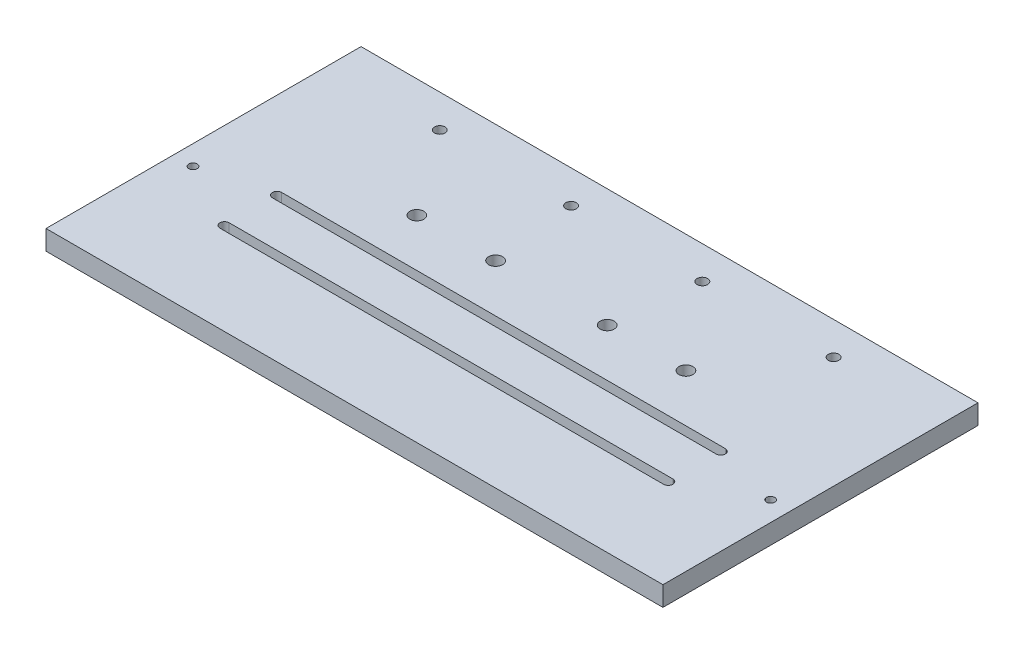
ISO-10303-21;
HEADER;
FILE_DESCRIPTION(('STEP AP214'),'2;1');
FILE_NAME('part.step','',(''),(''),'','','');
FILE_SCHEMA(('AUTOMOTIVE_DESIGN { 1 0 10303 214 1 1 1 1 }'));
ENDSEC;
DATA;
#1=APPLICATION_CONTEXT('core data for automotive mechanical design processes');
#2=APPLICATION_PROTOCOL_DEFINITION('international standard','automotive_design',2000,#1);
#3=PRODUCT_CONTEXT('',#1,'mechanical');
#4=PRODUCT('Part','Part','',(#3));
#5=PRODUCT_RELATED_PRODUCT_CATEGORY('part','',(#4));
#6=PRODUCT_DEFINITION_FORMATION('','',#4);
#7=PRODUCT_DEFINITION_CONTEXT('part definition',#1,'design');
#8=PRODUCT_DEFINITION('design','',#6,#7);
#9=PRODUCT_DEFINITION_SHAPE('','',#8);
#10=(LENGTH_UNIT() NAMED_UNIT(*) SI_UNIT(.MILLI.,.METRE.));
#11=(NAMED_UNIT(*) PLANE_ANGLE_UNIT() SI_UNIT($,.RADIAN.));
#12=(NAMED_UNIT(*) SI_UNIT($,.STERADIAN.) SOLID_ANGLE_UNIT());
#13=UNCERTAINTY_MEASURE_WITH_UNIT(LENGTH_MEASURE(1.E-05),#10,'distance_accuracy_value','');
#14=(GEOMETRIC_REPRESENTATION_CONTEXT(3) GLOBAL_UNCERTAINTY_ASSIGNED_CONTEXT((#13)) GLOBAL_UNIT_ASSIGNED_CONTEXT((#10,
#11,#12)) REPRESENTATION_CONTEXT('',''));
#15=CARTESIAN_POINT('',(0.,0.,0.));
#16=DIRECTION('',(0.,0.,1.));
#17=DIRECTION('',(1.,0.,0.));
#18=AXIS2_PLACEMENT_3D('',#15,#16,#17);
#19=CARTESIAN_POINT('',(95.25,4.7625,-60.325));
#20=DIRECTION('',(0.,1.,0.));
#21=DIRECTION('',(0.,0.,1.));
#22=AXIS2_PLACEMENT_3D('',#19,#20,#21);
#23=CYLINDRICAL_SURFACE('',#22,2.55269999999999);
#24=CARTESIAN_POINT('',(95.25,-4.7625,-60.325));
#25=DIRECTION('',(0.,1.,0.));
#26=DIRECTION('',(0.,0.,1.));
#27=AXIS2_PLACEMENT_3D('',#24,#25,#26);
#28=CIRCLE('',#27,2.55269999999999);
#29=CARTESIAN_POINT('',(95.25,-4.7625,-57.7723));
#30=VERTEX_POINT('',#29);
#31=EDGE_CURVE('E52',#30,#30,#28,.T.);
#32=ORIENTED_EDGE('',*,*,#31,.F.);
#33=EDGE_LOOP('',(#32));
#34=FACE_BOUND('',#33,.T.);
#35=CARTESIAN_POINT('',(95.25,4.7625,-60.325));
#36=DIRECTION('',(0.,1.,0.));
#37=DIRECTION('',(0.,0.,1.));
#38=AXIS2_PLACEMENT_3D('',#35,#36,#37);
#39=CIRCLE('',#38,2.55269999999999);
#40=CARTESIAN_POINT('',(95.25,4.7625,-57.7723));
#41=VERTEX_POINT('',#40);
#42=EDGE_CURVE('E11',#41,#41,#39,.T.);
#43=ORIENTED_EDGE('',*,*,#42,.T.);
#44=EDGE_LOOP('',(#43));
#45=FACE_BOUND('',#44,.T.);
#46=ADVANCED_FACE('F44',(#34,#45),#23,.F.);
#47=CARTESIAN_POINT('',(31.75,4.7625,-60.325));
#48=DIRECTION('',(0.,1.,0.));
#49=DIRECTION('',(0.,0.,1.));
#50=AXIS2_PLACEMENT_3D('',#47,#48,#49);
#51=CYLINDRICAL_SURFACE('',#50,2.55269999999999);
#52=CARTESIAN_POINT('',(31.75,-4.7625,-60.325));
#53=DIRECTION('',(0.,1.,0.));
#54=DIRECTION('',(0.,0.,1.));
#55=AXIS2_PLACEMENT_3D('',#52,#53,#54);
#56=CIRCLE('',#55,2.55269999999999);
#57=CARTESIAN_POINT('',(31.75,-4.7625,-57.7723));
#58=VERTEX_POINT('',#57);
#59=EDGE_CURVE('E274',#58,#58,#56,.T.);
#60=ORIENTED_EDGE('',*,*,#59,.F.);
#61=EDGE_LOOP('',(#60));
#62=FACE_BOUND('',#61,.T.);
#63=CARTESIAN_POINT('',(31.75,4.7625,-60.325));
#64=DIRECTION('',(0.,1.,0.));
#65=DIRECTION('',(0.,0.,1.));
#66=AXIS2_PLACEMENT_3D('',#63,#64,#65);
#67=CIRCLE('',#66,2.55269999999999);
#68=CARTESIAN_POINT('',(31.75,4.7625,-57.7723));
#69=VERTEX_POINT('',#68);
#70=EDGE_CURVE('E278',#69,#69,#67,.T.);
#71=ORIENTED_EDGE('',*,*,#70,.T.);
#72=EDGE_LOOP('',(#71));
#73=FACE_BOUND('',#72,.T.);
#74=ADVANCED_FACE('F289',(#62,#73),#51,.F.);
#75=CARTESIAN_POINT('',(0.,4.7625,76.2));
#76=DIRECTION('',(0.,0.,-1.));
#77=DIRECTION('',(-1.,0.,0.));
#78=AXIS2_PLACEMENT_3D('',#75,#76,#77);
#79=PLANE('',#78);
#80=DIRECTION('',(1.,0.,0.));
#81=VECTOR('',#80,1.);
#82=CARTESIAN_POINT('',(0.,-4.7625,76.2));
#83=LINE('',#82,#81);
#84=CARTESIAN_POINT('',(-149.225,-4.7625,76.2));
#85=VERTEX_POINT('',#84);
#86=CARTESIAN_POINT('',(149.225,-4.7625,76.2));
#87=VERTEX_POINT('',#86);
#88=EDGE_CURVE('E184',#85,#87,#83,.T.);
#89=ORIENTED_EDGE('',*,*,#88,.T.);
#90=DIRECTION('',(0.,-1.,0.));
#91=VECTOR('',#90,1.);
#92=CARTESIAN_POINT('',(149.225,4.7625,76.2));
#93=LINE('',#92,#91);
#94=CARTESIAN_POINT('',(149.225,4.7625,76.2));
#95=VERTEX_POINT('',#94);
#96=EDGE_CURVE('E270',#95,#87,#93,.T.);
#97=ORIENTED_EDGE('',*,*,#96,.F.);
#98=DIRECTION('',(1.,0.,0.));
#99=VECTOR('',#98,1.);
#100=CARTESIAN_POINT('',(0.,4.7625,76.2));
#101=LINE('',#100,#99);
#102=CARTESIAN_POINT('',(-149.225,4.7625,76.2));
#103=VERTEX_POINT('',#102);
#104=EDGE_CURVE('E231',#103,#95,#101,.T.);
#105=ORIENTED_EDGE('',*,*,#104,.F.);
#106=DIRECTION('',(0.,-1.,0.));
#107=VECTOR('',#106,1.);
#108=CARTESIAN_POINT('',(-149.225,4.7625,76.2));
#109=LINE('',#108,#107);
#110=EDGE_CURVE('E247',#103,#85,#109,.T.);
#111=ORIENTED_EDGE('',*,*,#110,.T.);
#112=EDGE_LOOP('',(#89,#97,#105,#111));
#113=FACE_BOUND('',#112,.T.);
#114=ADVANCED_FACE('F317',(#113),#79,.F.);
#115=CARTESIAN_POINT('',(149.225,4.7625,0.));
#116=DIRECTION('',(-1.,0.,0.));
#117=DIRECTION('',(0.,0.,1.));
#118=AXIS2_PLACEMENT_3D('',#115,#116,#117);
#119=PLANE('',#118);
#120=DIRECTION('',(0.,0.,-1.));
#121=VECTOR('',#120,1.);
#122=CARTESIAN_POINT('',(149.225,-4.7625,0.));
#123=LINE('',#122,#121);
#124=CARTESIAN_POINT('',(149.225,-4.7625,-76.2));
#125=VERTEX_POINT('',#124);
#126=EDGE_CURVE('E251',#87,#125,#123,.T.);
#127=ORIENTED_EDGE('',*,*,#126,.T.);
#128=DIRECTION('',(0.,-1.,0.));
#129=VECTOR('',#128,1.);
#130=CARTESIAN_POINT('',(149.225,4.7625,-76.2));
#131=LINE('',#130,#129);
#132=CARTESIAN_POINT('',(149.225,4.7625,-76.2));
#133=VERTEX_POINT('',#132);
#134=EDGE_CURVE('E267',#133,#125,#131,.T.);
#135=ORIENTED_EDGE('',*,*,#134,.F.);
#136=DIRECTION('',(0.,0.,-1.));
#137=VECTOR('',#136,1.);
#138=CARTESIAN_POINT('',(149.225,4.7625,0.));
#139=LINE('',#138,#137);
#140=EDGE_CURVE('E235',#95,#133,#139,.T.);
#141=ORIENTED_EDGE('',*,*,#140,.F.);
#142=ORIENTED_EDGE('',*,*,#96,.T.);
#143=EDGE_LOOP('',(#127,#135,#141,#142));
#144=FACE_BOUND('',#143,.T.);
#145=ADVANCED_FACE('F313',(#144),#119,.F.);
#146=CARTESIAN_POINT('',(0.,4.7625,-76.2));
#147=DIRECTION('',(0.,0.,-1.));
#148=DIRECTION('',(-1.,0.,0.));
#149=AXIS2_PLACEMENT_3D('',#146,#147,#148);
#150=PLANE('',#149);
#151=DIRECTION('',(1.,0.,0.));
#152=VECTOR('',#151,1.);
#153=CARTESIAN_POINT('',(0.,-4.7625,-76.2));
#154=LINE('',#153,#152);
#155=CARTESIAN_POINT('',(-149.225,-4.7625,-76.2));
#156=VERTEX_POINT('',#155);
#157=EDGE_CURVE('E255',#156,#125,#154,.T.);
#158=ORIENTED_EDGE('',*,*,#157,.F.);
#159=DIRECTION('',(0.,-1.,0.));
#160=VECTOR('',#159,1.);
#161=CARTESIAN_POINT('',(-149.225,4.7625,-76.2));
#162=LINE('',#161,#160);
#163=CARTESIAN_POINT('',(-149.225,4.7625,-76.2));
#164=VERTEX_POINT('',#163);
#165=EDGE_CURVE('E264',#164,#156,#162,.T.);
#166=ORIENTED_EDGE('',*,*,#165,.F.);
#167=DIRECTION('',(1.,0.,0.));
#168=VECTOR('',#167,1.);
#169=CARTESIAN_POINT('',(0.,4.7625,-76.2));
#170=LINE('',#169,#168);
#171=EDGE_CURVE('E239',#164,#133,#170,.T.);
#172=ORIENTED_EDGE('',*,*,#171,.T.);
#173=ORIENTED_EDGE('',*,*,#134,.T.);
#174=EDGE_LOOP('',(#158,#166,#172,#173));
#175=FACE_BOUND('',#174,.T.);
#176=ADVANCED_FACE('F303',(#175),#150,.T.);
#177=CARTESIAN_POINT('',(-149.225,4.7625,0.));
#178=DIRECTION('',(-1.,0.,0.));
#179=DIRECTION('',(0.,0.,1.));
#180=AXIS2_PLACEMENT_3D('',#177,#178,#179);
#181=PLANE('',#180);
#182=DIRECTION('',(0.,0.,-1.));
#183=VECTOR('',#182,1.);
#184=CARTESIAN_POINT('',(-149.225,-4.7625,0.));
#185=LINE('',#184,#183);
#186=EDGE_CURVE('E236',#85,#156,#185,.T.);
#187=ORIENTED_EDGE('',*,*,#186,.F.);
#188=ORIENTED_EDGE('',*,*,#110,.F.);
#189=DIRECTION('',(0.,0.,-1.));
#190=VECTOR('',#189,1.);
#191=CARTESIAN_POINT('',(-149.225,4.7625,0.));
#192=LINE('',#191,#190);
#193=EDGE_CURVE('E243',#103,#164,#192,.T.);
#194=ORIENTED_EDGE('',*,*,#193,.T.);
#195=ORIENTED_EDGE('',*,*,#165,.T.);
#196=EDGE_LOOP('',(#187,#188,#194,#195));
#197=FACE_BOUND('',#196,.T.);
#198=ADVANCED_FACE('F293',(#197),#181,.T.);
#199=CARTESIAN_POINT('',(0.,4.7625,0.));
#200=DIRECTION('',(0.,1.,0.));
#201=DIRECTION('',(0.,0.,1.));
#202=AXIS2_PLACEMENT_3D('',#199,#200,#201);
#203=PLANE('',#202);
#204=CARTESIAN_POINT('',(65.0875,4.7625,-19.05));
#205=DIRECTION('',(0.,1.,0.));
#206=DIRECTION('',(0.,0.,1.));
#207=AXIS2_PLACEMENT_3D('',#204,#205,#206);
#208=CIRCLE('',#207,3.3782);
#209=CARTESIAN_POINT('',(65.0875,4.7625,-15.6718));
#210=VERTEX_POINT('',#209);
#211=EDGE_CURVE('E536',#210,#210,#208,.T.);
#212=ORIENTED_EDGE('',*,*,#211,.F.);
#213=EDGE_LOOP('',(#212));
#214=FACE_BOUND('',#213,.T.);
#215=CARTESIAN_POINT('',(26.9875,4.7625,-19.05));
#216=DIRECTION('',(0.,1.,0.));
#217=DIRECTION('',(0.,0.,1.));
#218=AXIS2_PLACEMENT_3D('',#215,#216,#217);
#219=CIRCLE('',#218,3.3782);
#220=CARTESIAN_POINT('',(26.9875,4.7625,-15.6718));
#221=VERTEX_POINT('',#220);
#222=EDGE_CURVE('E540',#221,#221,#219,.T.);
#223=ORIENTED_EDGE('',*,*,#222,.F.);
#224=EDGE_LOOP('',(#223));
#225=FACE_BOUND('',#224,.T.);
#226=CARTESIAN_POINT('',(-65.0875,4.7625,-19.05));
#227=DIRECTION('',(0.,1.,0.));
#228=DIRECTION('',(0.,0.,1.));
#229=AXIS2_PLACEMENT_3D('',#226,#227,#228);
#230=CIRCLE('',#229,3.3782);
#231=CARTESIAN_POINT('',(-65.0875,4.7625,-15.6718));
#232=VERTEX_POINT('',#231);
#233=EDGE_CURVE('E550',#232,#232,#230,.T.);
#234=ORIENTED_EDGE('',*,*,#233,.F.);
#235=EDGE_LOOP('',(#234));
#236=FACE_BOUND('',#235,.T.);
#237=CARTESIAN_POINT('',(-26.9875,4.7625,-19.05));
#238=DIRECTION('',(0.,1.,0.));
#239=DIRECTION('',(0.,0.,1.));
#240=AXIS2_PLACEMENT_3D('',#237,#238,#239);
#241=CIRCLE('',#240,3.3782);
#242=CARTESIAN_POINT('',(-26.9875,4.7625,-15.6718));
#243=VERTEX_POINT('',#242);
#244=EDGE_CURVE('E558',#243,#243,#241,.T.);
#245=ORIENTED_EDGE('',*,*,#244,.F.);
#246=EDGE_LOOP('',(#245));
#247=FACE_BOUND('',#246,.T.);
#248=CARTESIAN_POINT('',(-139.7,4.7625,14.605));
#249=DIRECTION('',(0.,1.,0.));
#250=DIRECTION('',(0.,0.,1.));
#251=AXIS2_PLACEMENT_3D('',#248,#249,#250);
#252=CIRCLE('',#251,2.0193);
#253=CARTESIAN_POINT('',(-139.7,4.7625,16.6243));
#254=VERTEX_POINT('',#253);
#255=EDGE_CURVE('E566',#254,#254,#252,.T.);
#256=ORIENTED_EDGE('',*,*,#255,.F.);
#257=EDGE_LOOP('',(#256));
#258=FACE_BOUND('',#257,.T.);
#259=CARTESIAN_POINT('',(139.7,4.7625,14.605));
#260=DIRECTION('',(0.,1.,0.));
#261=DIRECTION('',(0.,0.,1.));
#262=AXIS2_PLACEMENT_3D('',#259,#260,#261);
#263=CIRCLE('',#262,2.0193);
#264=CARTESIAN_POINT('',(139.7,4.7625,16.6243));
#265=VERTEX_POINT('',#264);
#266=EDGE_CURVE('E574',#265,#265,#263,.T.);
#267=ORIENTED_EDGE('',*,*,#266,.F.);
#268=EDGE_LOOP('',(#267));
#269=FACE_BOUND('',#268,.T.);
#270=CARTESIAN_POINT('',(-31.75,4.7625,-60.325));
#271=DIRECTION('',(0.,1.,0.));
#272=DIRECTION('',(0.,0.,1.));
#273=AXIS2_PLACEMENT_3D('',#270,#271,#272);
#274=CIRCLE('',#273,2.55269999999999);
#275=CARTESIAN_POINT('',(-31.75,4.7625,-57.7723));
#276=VERTEX_POINT('',#275);
#277=EDGE_CURVE('E586',#276,#276,#274,.T.);
#278=ORIENTED_EDGE('',*,*,#277,.F.);
#279=EDGE_LOOP('',(#278));
#280=FACE_BOUND('',#279,.T.);
#281=CARTESIAN_POINT('',(-95.25,4.7625,-60.325));
#282=DIRECTION('',(0.,1.,0.));
#283=DIRECTION('',(0.,0.,1.));
#284=AXIS2_PLACEMENT_3D('',#281,#282,#283);
#285=CIRCLE('',#284,2.55269999999999);
#286=CARTESIAN_POINT('',(-95.25,4.7625,-57.7723));
#287=VERTEX_POINT('',#286);
#288=EDGE_CURVE('E589',#287,#287,#285,.T.);
#289=ORIENTED_EDGE('',*,*,#288,.F.);
#290=EDGE_LOOP('',(#289));
#291=FACE_BOUND('',#290,.T.);
#292=CARTESIAN_POINT('',(-107.315,4.7625,31.75));
#293=DIRECTION('',(0.,-1.,0.));
#294=DIRECTION('',(0.,0.,-1.));
#295=AXIS2_PLACEMENT_3D('',#292,#293,#294);
#296=CIRCLE('',#295,2.24789999999999);
#297=CARTESIAN_POINT('',(-107.315,4.7625,33.9979));
#298=VERTEX_POINT('',#297);
#299=CARTESIAN_POINT('',(-107.315,4.7625,29.5021));
#300=VERTEX_POINT('',#299);
#301=EDGE_CURVE('E137',#298,#300,#296,.T.);
#302=ORIENTED_EDGE('',*,*,#301,.T.);
#303=DIRECTION('',(1.,0.,0.));
#304=VECTOR('',#303,1.);
#305=CARTESIAN_POINT('',(-107.315,4.7625,29.5021));
#306=LINE('',#305,#304);
#307=CARTESIAN_POINT('',(107.315,4.7625,29.5021));
#308=VERTEX_POINT('',#307);
#309=EDGE_CURVE('E149',#300,#308,#306,.T.);
#310=ORIENTED_EDGE('',*,*,#309,.T.);
#311=CARTESIAN_POINT('',(107.315,4.7625,31.75));
#312=DIRECTION('',(0.,-1.,0.));
#313=DIRECTION('',(0.,0.,-1.));
#314=AXIS2_PLACEMENT_3D('',#311,#312,#313);
#315=CIRCLE('',#314,2.24789999999999);
#316=CARTESIAN_POINT('',(107.315,4.7625,33.9979));
#317=VERTEX_POINT('',#316);
#318=EDGE_CURVE('E59',#308,#317,#315,.T.);
#319=ORIENTED_EDGE('',*,*,#318,.T.);
#320=DIRECTION('',(-1.,0.,0.));
#321=VECTOR('',#320,1.);
#322=CARTESIAN_POINT('',(-107.315,4.7625,33.9979));
#323=LINE('',#322,#321);
#324=EDGE_CURVE('E146',#317,#298,#323,.T.);
#325=ORIENTED_EDGE('',*,*,#324,.T.);
#326=EDGE_LOOP('',(#302,#310,#319,#325));
#327=FACE_BOUND('',#326,.T.);
#328=CARTESIAN_POINT('',(-107.315,4.7625,6.35000000000003));
#329=DIRECTION('',(0.,-1.,0.));
#330=DIRECTION('',(0.,0.,-1.));
#331=AXIS2_PLACEMENT_3D('',#328,#329,#330);
#332=CIRCLE('',#331,2.2479);
#333=CARTESIAN_POINT('',(-107.315,4.7625,8.59790000000003));
#334=VERTEX_POINT('',#333);
#335=CARTESIAN_POINT('',(-107.315,4.7625,4.10210000000003));
#336=VERTEX_POINT('',#335);
#337=EDGE_CURVE('E190',#334,#336,#332,.T.);
#338=ORIENTED_EDGE('',*,*,#337,.T.);
#339=DIRECTION('',(1.,0.,0.));
#340=VECTOR('',#339,1.);
#341=CARTESIAN_POINT('',(-107.315,4.7625,4.10210000000003));
#342=LINE('',#341,#340);
#343=CARTESIAN_POINT('',(107.315,4.7625,4.10210000000003));
#344=VERTEX_POINT('',#343);
#345=EDGE_CURVE('E194',#336,#344,#342,.T.);
#346=ORIENTED_EDGE('',*,*,#345,.T.);
#347=CARTESIAN_POINT('',(107.315,4.7625,6.35000000000003));
#348=DIRECTION('',(0.,-1.,0.));
#349=DIRECTION('',(0.,0.,-1.));
#350=AXIS2_PLACEMENT_3D('',#347,#348,#349);
#351=CIRCLE('',#350,2.2479);
#352=CARTESIAN_POINT('',(107.315,4.7625,8.59790000000003));
#353=VERTEX_POINT('',#352);
#354=EDGE_CURVE('E67',#344,#353,#351,.T.);
#355=ORIENTED_EDGE('',*,*,#354,.T.);
#356=DIRECTION('',(-1.,0.,0.));
#357=VECTOR('',#356,1.);
#358=CARTESIAN_POINT('',(-107.315,4.7625,8.59790000000003));
#359=LINE('',#358,#357);
#360=EDGE_CURVE('E201',#353,#334,#359,.T.);
#361=ORIENTED_EDGE('',*,*,#360,.T.);
#362=EDGE_LOOP('',(#338,#346,#355,#361));
#363=FACE_BOUND('',#362,.T.);
#364=ORIENTED_EDGE('',*,*,#104,.T.);
#365=ORIENTED_EDGE('',*,*,#140,.T.);
#366=ORIENTED_EDGE('',*,*,#171,.F.);
#367=ORIENTED_EDGE('',*,*,#193,.F.);
#368=EDGE_LOOP('',(#364,#365,#366,#367));
#369=FACE_BOUND('',#368,.T.);
#370=ORIENTED_EDGE('',*,*,#70,.F.);
#371=EDGE_LOOP('',(#370));
#372=FACE_BOUND('',#371,.T.);
#373=ORIENTED_EDGE('',*,*,#42,.F.);
#374=EDGE_LOOP('',(#373));
#375=FACE_BOUND('',#374,.T.);
#376=ADVANCED_FACE('F154',(#214,#225,#236,#247,#258,#269,#280,#291,#327,#363,#369,#372,#375),
#203,.T.);
#377=CARTESIAN_POINT('',(0.,-4.7625,0.));
#378=DIRECTION('',(0.,1.,0.));
#379=DIRECTION('',(0.,0.,1.));
#380=AXIS2_PLACEMENT_3D('',#377,#378,#379);
#381=PLANE('',#380);
#382=CARTESIAN_POINT('',(65.0875,-4.7625,-19.05));
#383=DIRECTION('',(0.,1.,0.));
#384=DIRECTION('',(0.,0.,1.));
#385=AXIS2_PLACEMENT_3D('',#382,#383,#384);
#386=CIRCLE('',#385,3.3782);
#387=CARTESIAN_POINT('',(65.0875,-4.7625,-15.6718));
#388=VERTEX_POINT('',#387);
#389=EDGE_CURVE('E534',#388,#388,#386,.T.);
#390=ORIENTED_EDGE('',*,*,#389,.T.);
#391=EDGE_LOOP('',(#390));
#392=FACE_BOUND('',#391,.T.);
#393=CARTESIAN_POINT('',(26.9875,-4.7625,-19.05));
#394=DIRECTION('',(0.,1.,0.));
#395=DIRECTION('',(0.,0.,1.));
#396=AXIS2_PLACEMENT_3D('',#393,#394,#395);
#397=CIRCLE('',#396,3.3782);
#398=CARTESIAN_POINT('',(26.9875,-4.7625,-15.6718));
#399=VERTEX_POINT('',#398);
#400=EDGE_CURVE('E546',#399,#399,#397,.T.);
#401=ORIENTED_EDGE('',*,*,#400,.T.);
#402=EDGE_LOOP('',(#401));
#403=FACE_BOUND('',#402,.T.);
#404=CARTESIAN_POINT('',(-65.0875,-4.7625,-19.05));
#405=DIRECTION('',(0.,1.,0.));
#406=DIRECTION('',(0.,0.,1.));
#407=AXIS2_PLACEMENT_3D('',#404,#405,#406);
#408=CIRCLE('',#407,3.3782);
#409=CARTESIAN_POINT('',(-65.0875,-4.7625,-15.6718));
#410=VERTEX_POINT('',#409);
#411=EDGE_CURVE('E554',#410,#410,#408,.T.);
#412=ORIENTED_EDGE('',*,*,#411,.T.);
#413=EDGE_LOOP('',(#412));
#414=FACE_BOUND('',#413,.T.);
#415=CARTESIAN_POINT('',(-26.9875,-4.7625,-19.05));
#416=DIRECTION('',(0.,1.,0.));
#417=DIRECTION('',(0.,0.,1.));
#418=AXIS2_PLACEMENT_3D('',#415,#416,#417);
#419=CIRCLE('',#418,3.3782);
#420=CARTESIAN_POINT('',(-26.9875,-4.7625,-15.6718));
#421=VERTEX_POINT('',#420);
#422=EDGE_CURVE('E562',#421,#421,#419,.T.);
#423=ORIENTED_EDGE('',*,*,#422,.T.);
#424=EDGE_LOOP('',(#423));
#425=FACE_BOUND('',#424,.T.);
#426=CARTESIAN_POINT('',(-139.7,-4.7625,14.605));
#427=DIRECTION('',(0.,1.,0.));
#428=DIRECTION('',(0.,0.,1.));
#429=AXIS2_PLACEMENT_3D('',#426,#427,#428);
#430=CIRCLE('',#429,2.0193);
#431=CARTESIAN_POINT('',(-139.7,-4.7625,16.6243));
#432=VERTEX_POINT('',#431);
#433=EDGE_CURVE('E570',#432,#432,#430,.T.);
#434=ORIENTED_EDGE('',*,*,#433,.T.);
#435=EDGE_LOOP('',(#434));
#436=FACE_BOUND('',#435,.T.);
#437=CARTESIAN_POINT('',(139.7,-4.7625,14.605));
#438=DIRECTION('',(0.,1.,0.));
#439=DIRECTION('',(0.,0.,1.));
#440=AXIS2_PLACEMENT_3D('',#437,#438,#439);
#441=CIRCLE('',#440,2.0193);
#442=CARTESIAN_POINT('',(139.7,-4.7625,16.6243));
#443=VERTEX_POINT('',#442);
#444=EDGE_CURVE('E578',#443,#443,#441,.T.);
#445=ORIENTED_EDGE('',*,*,#444,.T.);
#446=EDGE_LOOP('',(#445));
#447=FACE_BOUND('',#446,.T.);
#448=CARTESIAN_POINT('',(-31.75,-4.7625,-60.325));
#449=DIRECTION('',(0.,1.,0.));
#450=DIRECTION('',(0.,0.,1.));
#451=AXIS2_PLACEMENT_3D('',#448,#449,#450);
#452=CIRCLE('',#451,2.55269999999999);
#453=CARTESIAN_POINT('',(-31.75,-4.7625,-57.7723));
#454=VERTEX_POINT('',#453);
#455=EDGE_CURVE('E582',#454,#454,#452,.T.);
#456=ORIENTED_EDGE('',*,*,#455,.T.);
#457=EDGE_LOOP('',(#456));
#458=FACE_BOUND('',#457,.T.);
#459=CARTESIAN_POINT('',(-95.25,-4.7625,-60.325));
#460=DIRECTION('',(0.,1.,0.));
#461=DIRECTION('',(0.,0.,1.));
#462=AXIS2_PLACEMENT_3D('',#459,#460,#461);
#463=CIRCLE('',#462,2.55269999999999);
#464=CARTESIAN_POINT('',(-95.25,-4.7625,-57.7723));
#465=VERTEX_POINT('',#464);
#466=EDGE_CURVE('E165',#465,#465,#463,.T.);
#467=ORIENTED_EDGE('',*,*,#466,.T.);
#468=EDGE_LOOP('',(#467));
#469=FACE_BOUND('',#468,.T.);
#470=DIRECTION('',(1.,0.,0.));
#471=VECTOR('',#470,1.);
#472=CARTESIAN_POINT('',(-107.315,-4.7625,29.5021));
#473=LINE('',#472,#471);
#474=CARTESIAN_POINT('',(-107.315,-4.7625,29.5021));
#475=VERTEX_POINT('',#474);
#476=CARTESIAN_POINT('',(107.315,-4.7625,29.5021));
#477=VERTEX_POINT('',#476);
#478=EDGE_CURVE('E174',#475,#477,#473,.T.);
#479=ORIENTED_EDGE('',*,*,#478,.F.);
#480=CARTESIAN_POINT('',(-107.315,-4.7625,31.75));
#481=DIRECTION('',(0.,-1.,0.));
#482=DIRECTION('',(0.,0.,-1.));
#483=AXIS2_PLACEMENT_3D('',#480,#481,#482);
#484=CIRCLE('',#483,2.24789999999999);
#485=CARTESIAN_POINT('',(-107.315,-4.7625,33.9979));
#486=VERTEX_POINT('',#485);
#487=EDGE_CURVE('E140',#486,#475,#484,.T.);
#488=ORIENTED_EDGE('',*,*,#487,.F.);
#489=DIRECTION('',(-1.,0.,0.));
#490=VECTOR('',#489,1.);
#491=CARTESIAN_POINT('',(-107.315,-4.7625,33.9979));
#492=LINE('',#491,#490);
#493=CARTESIAN_POINT('',(107.315,-4.7625,33.9979));
#494=VERTEX_POINT('',#493);
#495=EDGE_CURVE('E158',#494,#486,#492,.T.);
#496=ORIENTED_EDGE('',*,*,#495,.F.);
#497=CARTESIAN_POINT('',(107.315,-4.7625,31.75));
#498=DIRECTION('',(0.,-1.,0.));
#499=DIRECTION('',(0.,0.,-1.));
#500=AXIS2_PLACEMENT_3D('',#497,#498,#499);
#501=CIRCLE('',#500,2.24789999999999);
#502=EDGE_CURVE('E162',#477,#494,#501,.T.);
#503=ORIENTED_EDGE('',*,*,#502,.F.);
#504=EDGE_LOOP('',(#479,#488,#496,#503));
#505=FACE_BOUND('',#504,.T.);
#506=DIRECTION('',(1.,0.,0.));
#507=VECTOR('',#506,1.);
#508=CARTESIAN_POINT('',(-107.315,-4.7625,4.10210000000003));
#509=LINE('',#508,#507);
#510=CARTESIAN_POINT('',(-107.315,-4.7625,4.10210000000003));
#511=VERTEX_POINT('',#510);
#512=CARTESIAN_POINT('',(107.315,-4.7625,4.10210000000003));
#513=VERTEX_POINT('',#512);
#514=EDGE_CURVE('E209',#511,#513,#509,.T.);
#515=ORIENTED_EDGE('',*,*,#514,.F.);
#516=CARTESIAN_POINT('',(-107.315,-4.7625,6.35000000000003));
#517=DIRECTION('',(0.,-1.,0.));
#518=DIRECTION('',(0.,0.,-1.));
#519=AXIS2_PLACEMENT_3D('',#516,#517,#518);
#520=CIRCLE('',#519,2.2479);
#521=CARTESIAN_POINT('',(-107.315,-4.7625,8.59790000000003));
#522=VERTEX_POINT('',#521);
#523=EDGE_CURVE('E206',#522,#511,#520,.T.);
#524=ORIENTED_EDGE('',*,*,#523,.F.);
#525=DIRECTION('',(-1.,0.,0.));
#526=VECTOR('',#525,1.);
#527=CARTESIAN_POINT('',(-107.315,-4.7625,8.59790000000003));
#528=LINE('',#527,#526);
#529=CARTESIAN_POINT('',(107.315,-4.7625,8.59790000000003));
#530=VERTEX_POINT('',#529);
#531=EDGE_CURVE('E195',#530,#522,#528,.T.);
#532=ORIENTED_EDGE('',*,*,#531,.F.);
#533=CARTESIAN_POINT('',(107.315,-4.7625,6.35000000000003));
#534=DIRECTION('',(0.,-1.,0.));
#535=DIRECTION('',(0.,0.,-1.));
#536=AXIS2_PLACEMENT_3D('',#533,#534,#535);
#537=CIRCLE('',#536,2.2479);
#538=EDGE_CURVE('E213',#513,#530,#537,.T.);
#539=ORIENTED_EDGE('',*,*,#538,.F.);
#540=EDGE_LOOP('',(#515,#524,#532,#539));
#541=FACE_BOUND('',#540,.T.);
#542=ORIENTED_EDGE('',*,*,#88,.F.);
#543=ORIENTED_EDGE('',*,*,#186,.T.);
#544=ORIENTED_EDGE('',*,*,#157,.T.);
#545=ORIENTED_EDGE('',*,*,#126,.F.);
#546=EDGE_LOOP('',(#542,#543,#544,#545));
#547=FACE_BOUND('',#546,.T.);
#548=ORIENTED_EDGE('',*,*,#59,.T.);
#549=EDGE_LOOP('',(#548));
#550=FACE_BOUND('',#549,.T.);
#551=ORIENTED_EDGE('',*,*,#31,.T.);
#552=EDGE_LOOP('',(#551));
#553=FACE_BOUND('',#552,.T.);
#554=ADVANCED_FACE('F285',(#392,#403,#414,#425,#436,#447,#458,#469,#505,#541,#547,#550,#553),
#381,.F.);
#555=CARTESIAN_POINT('',(-107.315,4.7625,6.35000000000003));
#556=DIRECTION('',(0.,-1.,0.));
#557=DIRECTION('',(0.,0.,-1.));
#558=AXIS2_PLACEMENT_3D('',#555,#556,#557);
#559=CYLINDRICAL_SURFACE('',#558,2.2479);
#560=ORIENTED_EDGE('',*,*,#523,.T.);
#561=DIRECTION('',(0.,-1.,0.));
#562=VECTOR('',#561,1.);
#563=CARTESIAN_POINT('',(-107.315,4.7625,4.10210000000003));
#564=LINE('',#563,#562);
#565=EDGE_CURVE('E205',#336,#511,#564,.T.);
#566=ORIENTED_EDGE('',*,*,#565,.F.);
#567=ORIENTED_EDGE('',*,*,#337,.F.);
#568=DIRECTION('',(0.,-1.,0.));
#569=VECTOR('',#568,1.);
#570=CARTESIAN_POINT('',(-107.315,4.7625,8.59790000000003));
#571=LINE('',#570,#569);
#572=EDGE_CURVE('E175',#334,#522,#571,.T.);
#573=ORIENTED_EDGE('',*,*,#572,.T.);
#574=EDGE_LOOP('',(#560,#566,#567,#573));
#575=FACE_BOUND('',#574,.T.);
#576=ADVANCED_FACE('F300',(#575),#559,.F.);
#577=CARTESIAN_POINT('',(-107.315,4.7625,8.59790000000003));
#578=DIRECTION('',(0.,0.,1.));
#579=DIRECTION('',(1.,0.,0.));
#580=AXIS2_PLACEMENT_3D('',#577,#578,#579);
#581=PLANE('',#580);
#582=ORIENTED_EDGE('',*,*,#531,.T.);
#583=ORIENTED_EDGE('',*,*,#572,.F.);
#584=ORIENTED_EDGE('',*,*,#360,.F.);
#585=DIRECTION('',(0.,-1.,0.));
#586=VECTOR('',#585,1.);
#587=CARTESIAN_POINT('',(107.315,4.7625,8.59790000000003));
#588=LINE('',#587,#586);
#589=EDGE_CURVE('E222',#353,#530,#588,.T.);
#590=ORIENTED_EDGE('',*,*,#589,.T.);
#591=EDGE_LOOP('',(#582,#583,#584,#590));
#592=FACE_BOUND('',#591,.T.);
#593=ADVANCED_FACE('F359',(#592),#581,.F.);
#594=CARTESIAN_POINT('',(107.315,4.7625,6.35000000000003));
#595=DIRECTION('',(0.,-1.,0.));
#596=DIRECTION('',(0.,0.,-1.));
#597=AXIS2_PLACEMENT_3D('',#594,#595,#596);
#598=CYLINDRICAL_SURFACE('',#597,2.2479);
#599=ORIENTED_EDGE('',*,*,#538,.T.);
#600=ORIENTED_EDGE('',*,*,#589,.F.);
#601=ORIENTED_EDGE('',*,*,#354,.F.);
#602=DIRECTION('',(0.,-1.,0.));
#603=VECTOR('',#602,1.);
#604=CARTESIAN_POINT('',(107.315,4.7625,4.10210000000003));
#605=LINE('',#604,#603);
#606=EDGE_CURVE('E225',#344,#513,#605,.T.);
#607=ORIENTED_EDGE('',*,*,#606,.T.);
#608=EDGE_LOOP('',(#599,#600,#601,#607));
#609=FACE_BOUND('',#608,.T.);
#610=ADVANCED_FACE('F369',(#609),#598,.F.);
#611=CARTESIAN_POINT('',(-107.315,4.7625,4.10210000000003));
#612=DIRECTION('',(0.,0.,-1.));
#613=DIRECTION('',(-1.,0.,0.));
#614=AXIS2_PLACEMENT_3D('',#611,#612,#613);
#615=PLANE('',#614);
#616=ORIENTED_EDGE('',*,*,#514,.T.);
#617=ORIENTED_EDGE('',*,*,#606,.F.);
#618=ORIENTED_EDGE('',*,*,#345,.F.);
#619=ORIENTED_EDGE('',*,*,#565,.T.);
#620=EDGE_LOOP('',(#616,#617,#618,#619));
#621=FACE_BOUND('',#620,.T.);
#622=ADVANCED_FACE('F379',(#621),#615,.F.);
#623=CARTESIAN_POINT('',(-107.315,4.7625,31.75));
#624=DIRECTION('',(0.,-1.,0.));
#625=DIRECTION('',(0.,0.,-1.));
#626=AXIS2_PLACEMENT_3D('',#623,#624,#625);
#627=CYLINDRICAL_SURFACE('',#626,2.24789999999999);
#628=ORIENTED_EDGE('',*,*,#487,.T.);
#629=DIRECTION('',(0.,-1.,0.));
#630=VECTOR('',#629,1.);
#631=CARTESIAN_POINT('',(-107.315,4.7625,29.5021));
#632=LINE('',#631,#630);
#633=EDGE_CURVE('E133',#300,#475,#632,.T.);
#634=ORIENTED_EDGE('',*,*,#633,.F.);
#635=ORIENTED_EDGE('',*,*,#301,.F.);
#636=DIRECTION('',(0.,-1.,0.));
#637=VECTOR('',#636,1.);
#638=CARTESIAN_POINT('',(-107.315,4.7625,33.9979));
#639=LINE('',#638,#637);
#640=EDGE_CURVE('E181',#298,#486,#639,.T.);
#641=ORIENTED_EDGE('',*,*,#640,.T.);
#642=EDGE_LOOP('',(#628,#634,#635,#641));
#643=FACE_BOUND('',#642,.T.);
#644=ADVANCED_FACE('F135',(#643),#627,.F.);
#645=CARTESIAN_POINT('',(-107.315,4.7625,33.9979));
#646=DIRECTION('',(0.,0.,1.));
#647=DIRECTION('',(1.,0.,0.));
#648=AXIS2_PLACEMENT_3D('',#645,#646,#647);
#649=PLANE('',#648);
#650=ORIENTED_EDGE('',*,*,#495,.T.);
#651=ORIENTED_EDGE('',*,*,#640,.F.);
#652=ORIENTED_EDGE('',*,*,#324,.F.);
#653=DIRECTION('',(0.,-1.,0.));
#654=VECTOR('',#653,1.);
#655=CARTESIAN_POINT('',(107.315,4.7625,33.9979));
#656=LINE('',#655,#654);
#657=EDGE_CURVE('E185',#317,#494,#656,.T.);
#658=ORIENTED_EDGE('',*,*,#657,.T.);
#659=EDGE_LOOP('',(#650,#651,#652,#658));
#660=FACE_BOUND('',#659,.T.);
#661=ADVANCED_FACE('F396',(#660),#649,.F.);
#662=CARTESIAN_POINT('',(107.315,4.7625,31.75));
#663=DIRECTION('',(0.,-1.,0.));
#664=DIRECTION('',(0.,0.,-1.));
#665=AXIS2_PLACEMENT_3D('',#662,#663,#664);
#666=CYLINDRICAL_SURFACE('',#665,2.24789999999999);
#667=ORIENTED_EDGE('',*,*,#502,.T.);
#668=ORIENTED_EDGE('',*,*,#657,.F.);
#669=ORIENTED_EDGE('',*,*,#318,.F.);
#670=DIRECTION('',(0.,-1.,0.));
#671=VECTOR('',#670,1.);
#672=CARTESIAN_POINT('',(107.315,4.7625,29.5021));
#673=LINE('',#672,#671);
#674=EDGE_CURVE('E145',#308,#477,#673,.T.);
#675=ORIENTED_EDGE('',*,*,#674,.T.);
#676=EDGE_LOOP('',(#667,#668,#669,#675));
#677=FACE_BOUND('',#676,.T.);
#678=ADVANCED_FACE('F405',(#677),#666,.F.);
#679=CARTESIAN_POINT('',(-107.315,4.7625,29.5021));
#680=DIRECTION('',(0.,0.,-1.));
#681=DIRECTION('',(-1.,0.,0.));
#682=AXIS2_PLACEMENT_3D('',#679,#680,#681);
#683=PLANE('',#682);
#684=ORIENTED_EDGE('',*,*,#478,.T.);
#685=ORIENTED_EDGE('',*,*,#674,.F.);
#686=ORIENTED_EDGE('',*,*,#309,.F.);
#687=ORIENTED_EDGE('',*,*,#633,.T.);
#688=EDGE_LOOP('',(#684,#685,#686,#687));
#689=FACE_BOUND('',#688,.T.);
#690=ADVANCED_FACE('F150',(#689),#683,.F.);
#691=CARTESIAN_POINT('',(-95.25,4.7625,-60.325));
#692=DIRECTION('',(0.,1.,0.));
#693=DIRECTION('',(0.,0.,1.));
#694=AXIS2_PLACEMENT_3D('',#691,#692,#693);
#695=CYLINDRICAL_SURFACE('',#694,2.55269999999999);
#696=ORIENTED_EDGE('',*,*,#466,.F.);
#697=EDGE_LOOP('',(#696));
#698=FACE_BOUND('',#697,.T.);
#699=ORIENTED_EDGE('',*,*,#288,.T.);
#700=EDGE_LOOP('',(#699));
#701=FACE_BOUND('',#700,.T.);
#702=ADVANCED_FACE('F423',(#698,#701),#695,.F.);
#703=CARTESIAN_POINT('',(-31.75,4.7625,-60.325));
#704=DIRECTION('',(0.,1.,0.));
#705=DIRECTION('',(0.,0.,1.));
#706=AXIS2_PLACEMENT_3D('',#703,#704,#705);
#707=CYLINDRICAL_SURFACE('',#706,2.55269999999999);
#708=ORIENTED_EDGE('',*,*,#455,.F.);
#709=EDGE_LOOP('',(#708));
#710=FACE_BOUND('',#709,.T.);
#711=ORIENTED_EDGE('',*,*,#277,.T.);
#712=EDGE_LOOP('',(#711));
#713=FACE_BOUND('',#712,.T.);
#714=ADVANCED_FACE('F431',(#710,#713),#707,.F.);
#715=CARTESIAN_POINT('',(139.7,4.7625,14.605));
#716=DIRECTION('',(0.,1.,0.));
#717=DIRECTION('',(0.,0.,1.));
#718=AXIS2_PLACEMENT_3D('',#715,#716,#717);
#719=CYLINDRICAL_SURFACE('',#718,2.0193);
#720=ORIENTED_EDGE('',*,*,#444,.F.);
#721=EDGE_LOOP('',(#720));
#722=FACE_BOUND('',#721,.T.);
#723=ORIENTED_EDGE('',*,*,#266,.T.);
#724=EDGE_LOOP('',(#723));
#725=FACE_BOUND('',#724,.T.);
#726=ADVANCED_FACE('F448',(#722,#725),#719,.F.);
#727=CARTESIAN_POINT('',(-139.7,4.7625,14.605));
#728=DIRECTION('',(0.,1.,0.));
#729=DIRECTION('',(0.,0.,1.));
#730=AXIS2_PLACEMENT_3D('',#727,#728,#729);
#731=CYLINDRICAL_SURFACE('',#730,2.0193);
#732=ORIENTED_EDGE('',*,*,#433,.F.);
#733=EDGE_LOOP('',(#732));
#734=FACE_BOUND('',#733,.T.);
#735=ORIENTED_EDGE('',*,*,#255,.T.);
#736=EDGE_LOOP('',(#735));
#737=FACE_BOUND('',#736,.T.);
#738=ADVANCED_FACE('F457',(#734,#737),#731,.F.);
#739=CARTESIAN_POINT('',(-26.9875,4.7625,-19.05));
#740=DIRECTION('',(0.,1.,0.));
#741=DIRECTION('',(0.,0.,1.));
#742=AXIS2_PLACEMENT_3D('',#739,#740,#741);
#743=CYLINDRICAL_SURFACE('',#742,3.3782);
#744=ORIENTED_EDGE('',*,*,#422,.F.);
#745=EDGE_LOOP('',(#744));
#746=FACE_BOUND('',#745,.T.);
#747=ORIENTED_EDGE('',*,*,#244,.T.);
#748=EDGE_LOOP('',(#747));
#749=FACE_BOUND('',#748,.T.);
#750=ADVANCED_FACE('F467',(#746,#749),#743,.F.);
#751=CARTESIAN_POINT('',(-65.0875,4.7625,-19.05));
#752=DIRECTION('',(0.,1.,0.));
#753=DIRECTION('',(0.,0.,1.));
#754=AXIS2_PLACEMENT_3D('',#751,#752,#753);
#755=CYLINDRICAL_SURFACE('',#754,3.3782);
#756=ORIENTED_EDGE('',*,*,#411,.F.);
#757=EDGE_LOOP('',(#756));
#758=FACE_BOUND('',#757,.T.);
#759=ORIENTED_EDGE('',*,*,#233,.T.);
#760=EDGE_LOOP('',(#759));
#761=FACE_BOUND('',#760,.T.);
#762=ADVANCED_FACE('F477',(#758,#761),#755,.F.);
#763=CARTESIAN_POINT('',(26.9875,4.7625,-19.05));
#764=DIRECTION('',(0.,1.,0.));
#765=DIRECTION('',(0.,0.,1.));
#766=AXIS2_PLACEMENT_3D('',#763,#764,#765);
#767=CYLINDRICAL_SURFACE('',#766,3.3782);
#768=ORIENTED_EDGE('',*,*,#400,.F.);
#769=EDGE_LOOP('',(#768));
#770=FACE_BOUND('',#769,.T.);
#771=ORIENTED_EDGE('',*,*,#222,.T.);
#772=EDGE_LOOP('',(#771));
#773=FACE_BOUND('',#772,.T.);
#774=ADVANCED_FACE('F486',(#770,#773),#767,.F.);
#775=CARTESIAN_POINT('',(65.0875,4.7625,-19.05));
#776=DIRECTION('',(0.,1.,0.));
#777=DIRECTION('',(0.,0.,1.));
#778=AXIS2_PLACEMENT_3D('',#775,#776,#777);
#779=CYLINDRICAL_SURFACE('',#778,3.3782);
#780=ORIENTED_EDGE('',*,*,#389,.F.);
#781=EDGE_LOOP('',(#780));
#782=FACE_BOUND('',#781,.T.);
#783=ORIENTED_EDGE('',*,*,#211,.T.);
#784=EDGE_LOOP('',(#783));
#785=FACE_BOUND('',#784,.T.);
#786=ADVANCED_FACE('F495',(#782,#785),#779,.F.);
#787=CLOSED_SHELL('',(#46,#74,#114,#145,#176,#198,#376,#554,#576,#593,#610,#622,#644,#661,#678,
#690,#702,#714,#726,#738,#750,#762,#774,#786));
#788=MANIFOLD_SOLID_BREP('B2',#787);
#789=ADVANCED_BREP_SHAPE_REPRESENTATION('',(#18,#788),#14);
#790=SHAPE_DEFINITION_REPRESENTATION(#9,#789);
ENDSEC;
END-ISO-10303-21;
